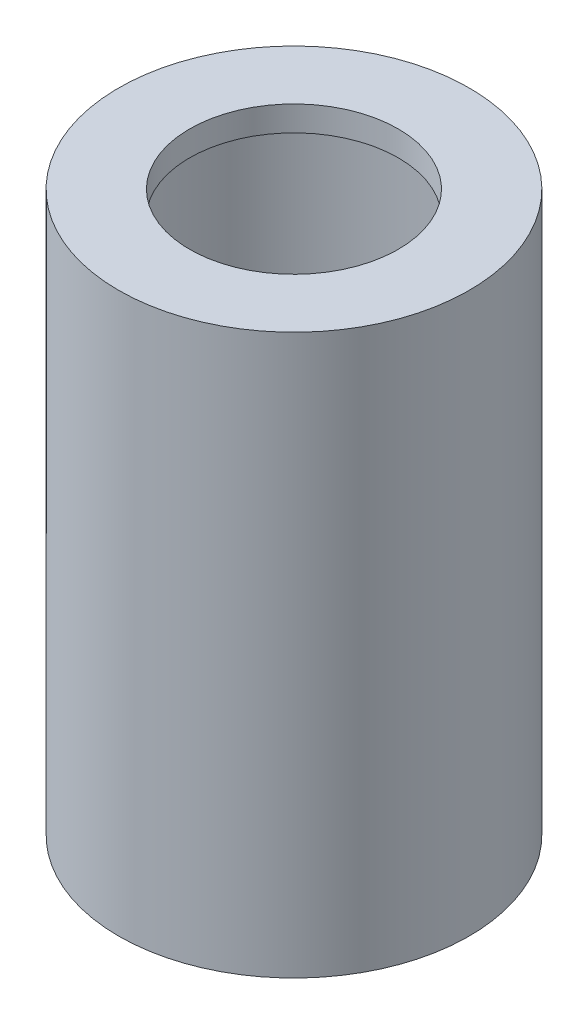
ISO-10303-21;
HEADER;
FILE_DESCRIPTION(('STEP AP214'),'2;1');
FILE_NAME('part.step','',(''),(''),'','','');
FILE_SCHEMA(('AUTOMOTIVE_DESIGN { 1 0 10303 214 1 1 1 1 }'));
ENDSEC;
DATA;
#1=APPLICATION_CONTEXT('core data for automotive mechanical design processes');
#2=APPLICATION_PROTOCOL_DEFINITION('international standard','automotive_design',2000,#1);
#3=PRODUCT_CONTEXT('',#1,'mechanical');
#4=PRODUCT('Part','Part','',(#3));
#5=PRODUCT_RELATED_PRODUCT_CATEGORY('part','',(#4));
#6=PRODUCT_DEFINITION_FORMATION('','',#4);
#7=PRODUCT_DEFINITION_CONTEXT('part definition',#1,'design');
#8=PRODUCT_DEFINITION('design','',#6,#7);
#9=PRODUCT_DEFINITION_SHAPE('','',#8);
#10=(LENGTH_UNIT() NAMED_UNIT(*) SI_UNIT(.MILLI.,.METRE.));
#11=(NAMED_UNIT(*) PLANE_ANGLE_UNIT() SI_UNIT($,.RADIAN.));
#12=(NAMED_UNIT(*) SI_UNIT($,.STERADIAN.) SOLID_ANGLE_UNIT());
#13=UNCERTAINTY_MEASURE_WITH_UNIT(LENGTH_MEASURE(1.E-05),#10,'distance_accuracy_value','');
#14=(GEOMETRIC_REPRESENTATION_CONTEXT(3) GLOBAL_UNCERTAINTY_ASSIGNED_CONTEXT((#13)) GLOBAL_UNIT_ASSIGNED_CONTEXT((#10,
#11,#12)) REPRESENTATION_CONTEXT('',''));
#15=CARTESIAN_POINT('',(0.,0.,0.));
#16=DIRECTION('',(0.,0.,1.));
#17=DIRECTION('',(1.,0.,0.));
#18=AXIS2_PLACEMENT_3D('',#15,#16,#17);
#19=CARTESIAN_POINT('',(0.,81.28,0.));
#20=DIRECTION('',(0.,-1.,0.));
#21=DIRECTION('',(0.,0.,-1.));
#22=AXIS2_PLACEMENT_3D('',#19,#20,#21);
#23=CYLINDRICAL_SURFACE('',#22,26.67);
#24=CARTESIAN_POINT('',(0.,0.,0.));
#25=DIRECTION('',(0.,1.,0.));
#26=DIRECTION('',(0.,0.,1.));
#27=AXIS2_PLACEMENT_3D('',#24,#25,#26);
#28=CIRCLE('',#27,26.67);
#29=CARTESIAN_POINT('',(0.,0.,26.67));
#30=VERTEX_POINT('',#29);
#31=EDGE_CURVE('E10',#30,#30,#28,.T.);
#32=ORIENTED_EDGE('',*,*,#31,.T.);
#33=EDGE_LOOP('',(#32));
#34=FACE_BOUND('',#33,.T.);
#35=CARTESIAN_POINT('',(0.,85.09,0.));
#36=DIRECTION('',(0.,1.,0.));
#37=DIRECTION('',(0.,0.,1.));
#38=AXIS2_PLACEMENT_3D('',#35,#36,#37);
#39=CIRCLE('',#38,26.67);
#40=CARTESIAN_POINT('',(0.,85.09,26.67));
#41=VERTEX_POINT('',#40);
#42=EDGE_CURVE('E54',#41,#41,#39,.T.);
#43=ORIENTED_EDGE('',*,*,#42,.F.);
#44=EDGE_LOOP('',(#43));
#45=FACE_BOUND('',#44,.T.);
#46=ADVANCED_FACE('F39',(#34,#45),#23,.T.);
#47=CARTESIAN_POINT('',(0.,0.,0.));
#48=DIRECTION('',(0.,1.,0.));
#49=DIRECTION('',(0.,0.,1.));
#50=AXIS2_PLACEMENT_3D('',#47,#48,#49);
#51=PLANE('',#50);
#52=ORIENTED_EDGE('',*,*,#31,.F.);
#53=EDGE_LOOP('',(#52));
#54=FACE_BOUND('',#53,.T.);
#55=ADVANCED_FACE('F79',(#54),#51,.F.);
#56=CARTESIAN_POINT('',(0.,81.28,0.));
#57=DIRECTION('',(0.,1.,0.));
#58=DIRECTION('',(0.,0.,1.));
#59=AXIS2_PLACEMENT_3D('',#56,#57,#58);
#60=PLANE('',#59);
#61=CARTESIAN_POINT('',(0.,81.28,0.));
#62=DIRECTION('',(0.,1.,0.));
#63=DIRECTION('',(0.,0.,1.));
#64=AXIS2_PLACEMENT_3D('',#61,#62,#63);
#65=CIRCLE('',#64,15.875);
#66=CARTESIAN_POINT('',(0.,81.28,-15.875));
#67=VERTEX_POINT('',#66);
#68=EDGE_CURVE('E59',#67,#67,#65,.T.);
#69=ORIENTED_EDGE('',*,*,#68,.T.);
#70=EDGE_LOOP('',(#69));
#71=FACE_BOUND('',#70,.T.);
#72=CARTESIAN_POINT('',(0.,81.28,0.));
#73=DIRECTION('',(0.,1.,0.));
#74=DIRECTION('',(0.,0.,1.));
#75=AXIS2_PLACEMENT_3D('',#72,#73,#74);
#76=CIRCLE('',#75,24.13);
#77=CARTESIAN_POINT('',(0.,81.28,24.13));
#78=VERTEX_POINT('',#77);
#79=EDGE_CURVE('E49',#78,#78,#76,.T.);
#80=ORIENTED_EDGE('',*,*,#79,.F.);
#81=EDGE_LOOP('',(#80));
#82=FACE_BOUND('',#81,.T.);
#83=ADVANCED_FACE('F70',(#71,#82),#60,.F.);
#84=CARTESIAN_POINT('',(0.,85.09,0.));
#85=DIRECTION('',(0.,1.,0.));
#86=DIRECTION('',(0.,0.,1.));
#87=AXIS2_PLACEMENT_3D('',#84,#85,#86);
#88=PLANE('',#87);
#89=ORIENTED_EDGE('',*,*,#42,.T.);
#90=EDGE_LOOP('',(#89));
#91=FACE_BOUND('',#90,.T.);
#92=CARTESIAN_POINT('',(0.,85.09,0.));
#93=DIRECTION('',(0.,1.,0.));
#94=DIRECTION('',(0.,0.,1.));
#95=AXIS2_PLACEMENT_3D('',#92,#93,#94);
#96=CIRCLE('',#95,15.875);
#97=CARTESIAN_POINT('',(0.,85.09,-15.875));
#98=VERTEX_POINT('',#97);
#99=EDGE_CURVE('E58',#98,#98,#96,.T.);
#100=ORIENTED_EDGE('',*,*,#99,.F.);
#101=EDGE_LOOP('',(#100));
#102=FACE_BOUND('',#101,.T.);
#103=ADVANCED_FACE('F68',(#91,#102),#88,.T.);
#104=CARTESIAN_POINT('',(0.,85.09,0.));
#105=DIRECTION('',(0.,-1.,0.));
#106=DIRECTION('',(0.,0.,-1.));
#107=AXIS2_PLACEMENT_3D('',#104,#105,#106);
#108=CYLINDRICAL_SURFACE('',#107,15.875);
#109=CARTESIAN_POINT('',(0.,85.09,-15.875));
#110=CARTESIAN_POINT('',(0.,85.0503125,-15.875));
#111=CARTESIAN_POINT('',(0.,85.010625,-15.875));
#112=CARTESIAN_POINT('',(0.,84.93125,-15.875));
#113=CARTESIAN_POINT('',(0.,84.8915625,-15.875));
#114=CARTESIAN_POINT('',(0.,84.8121875,-15.875));
#115=CARTESIAN_POINT('',(0.,84.7725,-15.875));
#116=CARTESIAN_POINT('',(0.,84.693125,-15.875));
#117=CARTESIAN_POINT('',(0.,84.6534375,-15.875));
#118=CARTESIAN_POINT('',(0.,84.5740625,-15.875));
#119=CARTESIAN_POINT('',(0.,84.534375,-15.875));
#120=CARTESIAN_POINT('',(0.,84.455,-15.875));
#121=CARTESIAN_POINT('',(0.,84.4153125,-15.875));
#122=CARTESIAN_POINT('',(0.,84.3359375,-15.875));
#123=CARTESIAN_POINT('',(0.,84.29625,-15.875));
#124=CARTESIAN_POINT('',(0.,84.216875,-15.875));
#125=CARTESIAN_POINT('',(0.,84.1771875,-15.875));
#126=CARTESIAN_POINT('',(0.,84.0978125,-15.875));
#127=CARTESIAN_POINT('',(0.,84.058125,-15.875));
#128=CARTESIAN_POINT('',(0.,83.97875,-15.875));
#129=CARTESIAN_POINT('',(0.,83.9390625,-15.875));
#130=CARTESIAN_POINT('',(0.,83.8596875,-15.875));
#131=CARTESIAN_POINT('',(0.,83.82,-15.875));
#132=CARTESIAN_POINT('',(0.,83.740625,-15.875));
#133=CARTESIAN_POINT('',(0.,83.7009375,-15.875));
#134=CARTESIAN_POINT('',(0.,83.6215625,-15.875));
#135=CARTESIAN_POINT('',(0.,83.581875,-15.875));
#136=CARTESIAN_POINT('',(0.,83.5025,-15.875));
#137=CARTESIAN_POINT('',(0.,83.4628125,-15.875));
#138=CARTESIAN_POINT('',(0.,83.3834375,-15.875));
#139=CARTESIAN_POINT('',(0.,83.34375,-15.875));
#140=CARTESIAN_POINT('',(0.,83.264375,-15.875));
#141=CARTESIAN_POINT('',(0.,83.2246875,-15.875));
#142=CARTESIAN_POINT('',(0.,83.1453125,-15.875));
#143=CARTESIAN_POINT('',(0.,83.105625,-15.875));
#144=CARTESIAN_POINT('',(0.,83.02625,-15.875));
#145=CARTESIAN_POINT('',(0.,82.9865625,-15.875));
#146=CARTESIAN_POINT('',(0.,82.9071875,-15.875));
#147=CARTESIAN_POINT('',(0.,82.8675,-15.875));
#148=CARTESIAN_POINT('',(0.,82.788125,-15.875));
#149=CARTESIAN_POINT('',(0.,82.7484375,-15.875));
#150=CARTESIAN_POINT('',(0.,82.6690625,-15.875));
#151=CARTESIAN_POINT('',(0.,82.629375,-15.875));
#152=CARTESIAN_POINT('',(0.,82.55,-15.875));
#153=CARTESIAN_POINT('',(0.,82.5103125,-15.875));
#154=CARTESIAN_POINT('',(0.,82.4309375,-15.875));
#155=CARTESIAN_POINT('',(0.,82.39125,-15.875));
#156=CARTESIAN_POINT('',(0.,82.311875,-15.875));
#157=CARTESIAN_POINT('',(0.,82.2721875,-15.875));
#158=CARTESIAN_POINT('',(0.,82.1928125,-15.875));
#159=CARTESIAN_POINT('',(0.,82.153125,-15.875));
#160=CARTESIAN_POINT('',(0.,82.07375,-15.875));
#161=CARTESIAN_POINT('',(0.,82.0340625,-15.875));
#162=CARTESIAN_POINT('',(0.,81.9546875,-15.875));
#163=CARTESIAN_POINT('',(0.,81.915,-15.875));
#164=CARTESIAN_POINT('',(0.,81.835625,-15.875));
#165=CARTESIAN_POINT('',(0.,81.7959375,-15.875));
#166=CARTESIAN_POINT('',(0.,81.7165625,-15.875));
#167=CARTESIAN_POINT('',(0.,81.676875,-15.875));
#168=CARTESIAN_POINT('',(0.,81.5975,-15.875));
#169=CARTESIAN_POINT('',(0.,81.5578125,-15.875));
#170=CARTESIAN_POINT('',(0.,81.4784375,-15.875));
#171=CARTESIAN_POINT('',(0.,81.43875,-15.875));
#172=CARTESIAN_POINT('',(0.,81.359375,-15.875));
#173=CARTESIAN_POINT('',(0.,81.3196875,-15.875));
#174=CARTESIAN_POINT('',(0.,81.28,-15.875));
#175=B_SPLINE_CURVE_WITH_KNOTS('',3,(#109,#110,#111,#112,#113,#114,#115,#116,#117,#118,#119,
#120,#121,#122,#123,#124,#125,#126,#127,#128,#129,#130,#131,#132,#133,#134,#135,#136,#137,#138,
#139,#140,#141,#142,#143,#144,#145,#146,#147,#148,#149,#150,#151,#152,#153,#154,#155,#156,#157,
#158,#159,#160,#161,#162,#163,#164,#165,#166,#167,#168,#169,#170,#171,#172,#173,#174),
.UNSPECIFIED.,.F.,.F.,(4,2,2,2,2,2,2,2,2,2,2,2,2,2,2,2,2,2,2,2,2,2,2,2,2,2,2,2,2,2,2,2,4),(0.,
0.119062500000003,0.238125000000006,0.357187500000009,0.476250000000011,0.5953125,
0.714375000000003,0.833437500000006,0.952500000000009,1.07156250000001,1.190625,1.3096875,
1.42875000000001,1.54781250000001,1.666875,1.7859375,1.905,2.02406250000001,2.14312500000001,
2.2621875,2.38125,2.5003125,2.61937500000001,2.7384375,2.8575,2.9765625,3.095625,
3.21468750000001,3.33375,3.4528125,3.571875,3.6909375,3.80999999999999),.UNSPECIFIED.);
#176=EDGE_CURVE('BSEAM65',#98,#67,#175,.T.);
#177=ORIENTED_EDGE('',*,*,#99,.T.);
#178=ORIENTED_EDGE('',*,*,#68,.F.);
#179=ORIENTED_EDGE('',*,*,#176,.T.);
#180=ORIENTED_EDGE('',*,*,#176,.F.);
#181=EDGE_LOOP('',(#177,#179,#178,#180));
#182=FACE_BOUND('',#181,.T.);
#183=ADVANCED_FACE('F65',(#182),#108,.F.);
#184=CARTESIAN_POINT('',(0.,2.54,0.));
#185=DIRECTION('',(0.,1.,0.));
#186=DIRECTION('',(0.,0.,1.));
#187=AXIS2_PLACEMENT_3D('',#184,#185,#186);
#188=PLANE('',#187);
#189=CARTESIAN_POINT('',(0.,2.54,0.));
#190=DIRECTION('',(0.,1.,0.));
#191=DIRECTION('',(0.,0.,1.));
#192=AXIS2_PLACEMENT_3D('',#189,#190,#191);
#193=CIRCLE('',#192,24.13);
#194=CARTESIAN_POINT('',(0.,2.54,24.13));
#195=VERTEX_POINT('',#194);
#196=EDGE_CURVE('E45',#195,#195,#193,.T.);
#197=ORIENTED_EDGE('',*,*,#196,.T.);
#198=EDGE_LOOP('',(#197));
#199=FACE_BOUND('',#198,.T.);
#200=ADVANCED_FACE('F77',(#199),#188,.T.);
#201=CARTESIAN_POINT('',(0.,81.28,0.));
#202=DIRECTION('',(0.,-1.,0.));
#203=DIRECTION('',(0.,0.,-1.));
#204=AXIS2_PLACEMENT_3D('',#201,#202,#203);
#205=CYLINDRICAL_SURFACE('',#204,24.13);
#206=ORIENTED_EDGE('',*,*,#79,.T.);
#207=EDGE_LOOP('',(#206));
#208=FACE_BOUND('',#207,.T.);
#209=ORIENTED_EDGE('',*,*,#196,.F.);
#210=EDGE_LOOP('',(#209));
#211=FACE_BOUND('',#210,.T.);
#212=ADVANCED_FACE('F95',(#208,#211),#205,.F.);
#213=CLOSED_SHELL('',(#46,#55,#83,#103,#183,#200,#212));
#214=MANIFOLD_SOLID_BREP('B2',#213);
#215=ADVANCED_BREP_SHAPE_REPRESENTATION('',(#18,#214),#14);
#216=SHAPE_DEFINITION_REPRESENTATION(#9,#215);
ENDSEC;
END-ISO-10303-21;
